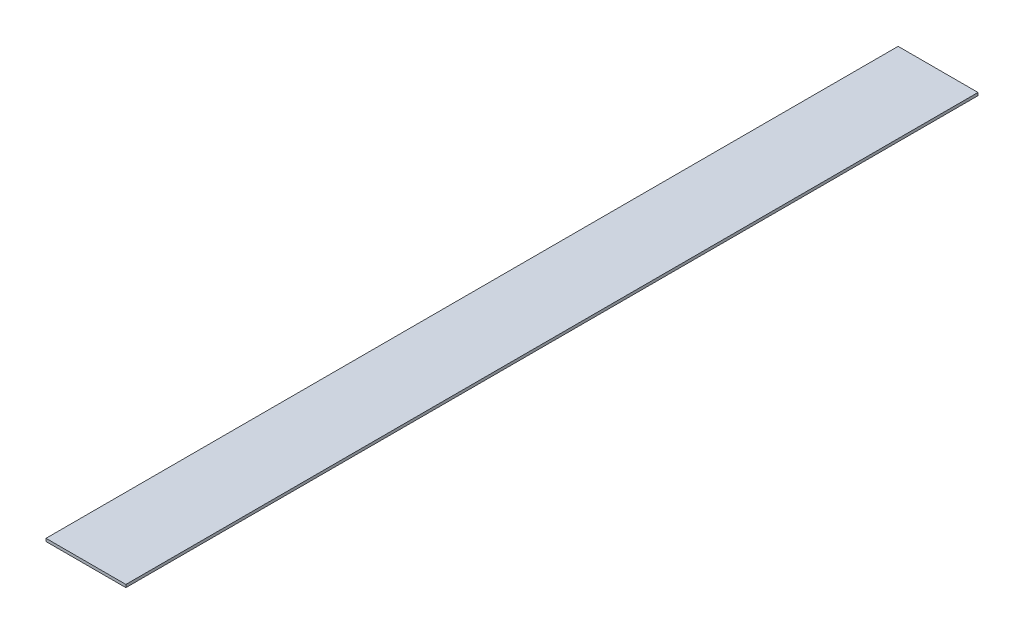
ISO-10303-21;
HEADER;
FILE_DESCRIPTION(('STEP AP214'),'2;1');
FILE_NAME('part.step','',(''),(''),'','','');
FILE_SCHEMA(('AUTOMOTIVE_DESIGN { 1 0 10303 214 1 1 1 1 }'));
ENDSEC;
DATA;
#1=APPLICATION_CONTEXT('core data for automotive mechanical design processes');
#2=APPLICATION_PROTOCOL_DEFINITION('international standard','automotive_design',2000,#1);
#3=PRODUCT_CONTEXT('',#1,'mechanical');
#4=PRODUCT('Part','Part','',(#3));
#5=PRODUCT_RELATED_PRODUCT_CATEGORY('part','',(#4));
#6=PRODUCT_DEFINITION_FORMATION('','',#4);
#7=PRODUCT_DEFINITION_CONTEXT('part definition',#1,'design');
#8=PRODUCT_DEFINITION('design','',#6,#7);
#9=PRODUCT_DEFINITION_SHAPE('','',#8);
#10=(LENGTH_UNIT() NAMED_UNIT(*) SI_UNIT(.MILLI.,.METRE.));
#11=(NAMED_UNIT(*) PLANE_ANGLE_UNIT() SI_UNIT($,.RADIAN.));
#12=(NAMED_UNIT(*) SI_UNIT($,.STERADIAN.) SOLID_ANGLE_UNIT());
#13=UNCERTAINTY_MEASURE_WITH_UNIT(LENGTH_MEASURE(1.E-05),#10,'distance_accuracy_value','');
#14=(GEOMETRIC_REPRESENTATION_CONTEXT(3) GLOBAL_UNCERTAINTY_ASSIGNED_CONTEXT((#13)) GLOBAL_UNIT_ASSIGNED_CONTEXT((#10,
#11,#12)) REPRESENTATION_CONTEXT('',''));
#15=CARTESIAN_POINT('',(0.,0.,0.));
#16=DIRECTION('',(0.,0.,1.));
#17=DIRECTION('',(1.,0.,0.));
#18=AXIS2_PLACEMENT_3D('',#15,#16,#17);
#19=CARTESIAN_POINT('',(-173.489347611488,472.173427831157,90.7755469976339));
#20=DIRECTION('',(0.,-1.,0.));
#21=DIRECTION('',(0.,0.,-1.));
#22=AXIS2_PLACEMENT_3D('',#19,#20,#21);
#23=PLANE('',#22);
#24=DIRECTION('',(0.,0.,1.));
#25=VECTOR('',#24,1.);
#26=CARTESIAN_POINT('',(-13.4893476114887,472.173427831157,-523.85));
#27=LINE('',#26,#25);
#28=CARTESIAN_POINT('',(-13.4893476114887,472.173427831157,346.05));
#29=VERTEX_POINT('',#28);
#30=CARTESIAN_POINT('',(-13.4893476114887,472.173427831157,-613.95));
#31=VERTEX_POINT('',#30);
#32=EDGE_CURVE('E55',#29,#31,#27,.F.);
#33=ORIENTED_EDGE('',*,*,#32,.F.);
#34=DIRECTION('',(1.,0.,0.));
#35=VECTOR('',#34,1.);
#36=CARTESIAN_POINT('',(6.51065238851132,472.173427831157,346.05));
#37=LINE('',#36,#35);
#38=CARTESIAN_POINT('',(76.5106523885113,472.173427831157,346.05));
#39=VERTEX_POINT('',#38);
#40=EDGE_CURVE('E57',#39,#29,#37,.F.);
#41=ORIENTED_EDGE('',*,*,#40,.F.);
#42=DIRECTION('',(0.,0.,-1.));
#43=VECTOR('',#42,1.);
#44=CARTESIAN_POINT('',(76.5106523885113,472.173427831157,255.95));
#45=LINE('',#44,#43);
#46=CARTESIAN_POINT('',(76.5106523885113,472.173427831157,-613.95));
#47=VERTEX_POINT('',#46);
#48=EDGE_CURVE('E19',#47,#39,#45,.F.);
#49=ORIENTED_EDGE('',*,*,#48,.F.);
#50=DIRECTION('',(-1.,0.,0.));
#51=VECTOR('',#50,1.);
#52=CARTESIAN_POINT('',(76.5106523885113,472.173427831157,-613.95));
#53=LINE('',#52,#51);
#54=EDGE_CURVE('E86',#31,#47,#53,.F.);
#55=ORIENTED_EDGE('',*,*,#54,.F.);
#56=EDGE_LOOP('',(#33,#41,#49,#55));
#57=FACE_BOUND('',#56,.T.);
#58=ADVANCED_FACE('F16',(#57),#23,.F.);
#59=CARTESIAN_POINT('',(76.5106523885113,472.173427831157,255.95));
#60=DIRECTION('',(1.,0.,0.));
#61=DIRECTION('',(0.,0.,-1.));
#62=AXIS2_PLACEMENT_3D('',#59,#60,#61);
#63=PLANE('',#62);
#64=DIRECTION('',(0.,0.,-1.));
#65=VECTOR('',#64,1.);
#66=CARTESIAN_POINT('',(76.5106523885113,468.998427831157,90.7755469976339));
#67=LINE('',#66,#65);
#68=CARTESIAN_POINT('',(76.5106523885113,468.998427831157,-613.95));
#69=VERTEX_POINT('',#68);
#70=CARTESIAN_POINT('',(76.5106523885113,468.998427831157,346.05));
#71=VERTEX_POINT('',#70);
#72=EDGE_CURVE('E92',#69,#71,#67,.F.);
#73=ORIENTED_EDGE('',*,*,#72,.F.);
#74=DIRECTION('',(0.,1.,0.));
#75=VECTOR('',#74,1.);
#76=CARTESIAN_POINT('',(76.5106523885113,472.173427831157,-613.95));
#77=LINE('',#76,#75);
#78=EDGE_CURVE('E69',#47,#69,#77,.F.);
#79=ORIENTED_EDGE('',*,*,#78,.F.);
#80=ORIENTED_EDGE('',*,*,#48,.T.);
#81=DIRECTION('',(0.,1.,0.));
#82=VECTOR('',#81,1.);
#83=CARTESIAN_POINT('',(76.5106523885113,472.173427831157,346.05));
#84=LINE('',#83,#82);
#85=EDGE_CURVE('E64',#71,#39,#84,.T.);
#86=ORIENTED_EDGE('',*,*,#85,.F.);
#87=EDGE_LOOP('',(#73,#79,#80,#86));
#88=FACE_BOUND('',#87,.T.);
#89=ADVANCED_FACE('F66',(#88),#63,.T.);
#90=CARTESIAN_POINT('',(6.51065238851132,472.173427831157,346.05));
#91=DIRECTION('',(0.,0.,1.));
#92=DIRECTION('',(1.,0.,0.));
#93=AXIS2_PLACEMENT_3D('',#90,#91,#92);
#94=PLANE('',#93);
#95=DIRECTION('',(1.,0.,0.));
#96=VECTOR('',#95,1.);
#97=CARTESIAN_POINT('',(-173.489347611488,468.998427831157,346.05));
#98=LINE('',#97,#96);
#99=CARTESIAN_POINT('',(-13.4893476114887,468.998427831157,346.05));
#100=VERTEX_POINT('',#99);
#101=EDGE_CURVE('E74',#71,#100,#98,.F.);
#102=ORIENTED_EDGE('',*,*,#101,.F.);
#103=ORIENTED_EDGE('',*,*,#85,.T.);
#104=ORIENTED_EDGE('',*,*,#40,.T.);
#105=DIRECTION('',(0.,1.,0.));
#106=VECTOR('',#105,1.);
#107=CARTESIAN_POINT('',(-13.4893476114887,472.173427831157,346.05));
#108=LINE('',#107,#106);
#109=EDGE_CURVE('E81',#100,#29,#108,.T.);
#110=ORIENTED_EDGE('',*,*,#109,.F.);
#111=EDGE_LOOP('',(#102,#103,#104,#110));
#112=FACE_BOUND('',#111,.T.);
#113=ADVANCED_FACE('F72',(#112),#94,.T.);
#114=CARTESIAN_POINT('',(-13.4893476114887,472.173427831157,-523.85));
#115=DIRECTION('',(-1.,0.,0.));
#116=DIRECTION('',(0.,0.,1.));
#117=AXIS2_PLACEMENT_3D('',#114,#115,#116);
#118=PLANE('',#117);
#119=DIRECTION('',(0.,0.,-1.));
#120=VECTOR('',#119,1.);
#121=CARTESIAN_POINT('',(-13.4893476114887,468.998427831157,90.7755469976339));
#122=LINE('',#121,#120);
#123=CARTESIAN_POINT('',(-13.4893476114887,468.998427831157,-613.95));
#124=VERTEX_POINT('',#123);
#125=EDGE_CURVE('E26',#100,#124,#122,.T.);
#126=ORIENTED_EDGE('',*,*,#125,.F.);
#127=ORIENTED_EDGE('',*,*,#109,.T.);
#128=ORIENTED_EDGE('',*,*,#32,.T.);
#129=DIRECTION('',(0.,1.,0.));
#130=VECTOR('',#129,1.);
#131=CARTESIAN_POINT('',(-13.4893476114887,472.173427831157,-613.95));
#132=LINE('',#131,#130);
#133=EDGE_CURVE('E35',#124,#31,#132,.T.);
#134=ORIENTED_EDGE('',*,*,#133,.F.);
#135=EDGE_LOOP('',(#126,#127,#128,#134));
#136=FACE_BOUND('',#135,.T.);
#137=ADVANCED_FACE('F101',(#136),#118,.T.);
#138=CARTESIAN_POINT('',(76.5106523885113,472.173427831157,-613.95));
#139=DIRECTION('',(0.,0.,-1.));
#140=DIRECTION('',(-1.,0.,0.));
#141=AXIS2_PLACEMENT_3D('',#138,#139,#140);
#142=PLANE('',#141);
#143=DIRECTION('',(1.,0.,0.));
#144=VECTOR('',#143,1.);
#145=CARTESIAN_POINT('',(-173.489347611488,468.998427831157,-613.95));
#146=LINE('',#145,#144);
#147=EDGE_CURVE('E11',#124,#69,#146,.T.);
#148=ORIENTED_EDGE('',*,*,#147,.F.);
#149=ORIENTED_EDGE('',*,*,#133,.T.);
#150=ORIENTED_EDGE('',*,*,#54,.T.);
#151=ORIENTED_EDGE('',*,*,#78,.T.);
#152=EDGE_LOOP('',(#148,#149,#150,#151));
#153=FACE_BOUND('',#152,.T.);
#154=ADVANCED_FACE('F103',(#153),#142,.T.);
#155=CARTESIAN_POINT('',(-173.489347611488,468.998427831157,90.7755469976339));
#156=DIRECTION('',(0.,-1.,0.));
#157=DIRECTION('',(0.,0.,-1.));
#158=AXIS2_PLACEMENT_3D('',#155,#156,#157);
#159=PLANE('',#158);
#160=ORIENTED_EDGE('',*,*,#125,.T.);
#161=ORIENTED_EDGE('',*,*,#147,.T.);
#162=ORIENTED_EDGE('',*,*,#72,.T.);
#163=ORIENTED_EDGE('',*,*,#101,.T.);
#164=EDGE_LOOP('',(#160,#161,#162,#163));
#165=FACE_BOUND('',#164,.T.);
#166=ADVANCED_FACE('F100',(#165),#159,.T.);
#167=CLOSED_SHELL('',(#58,#89,#113,#137,#154,#166));
#168=MANIFOLD_SOLID_BREP('B1',#167);
#169=ADVANCED_BREP_SHAPE_REPRESENTATION('',(#18,#168),#14);
#170=SHAPE_DEFINITION_REPRESENTATION(#9,#169);
ENDSEC;
END-ISO-10303-21;
